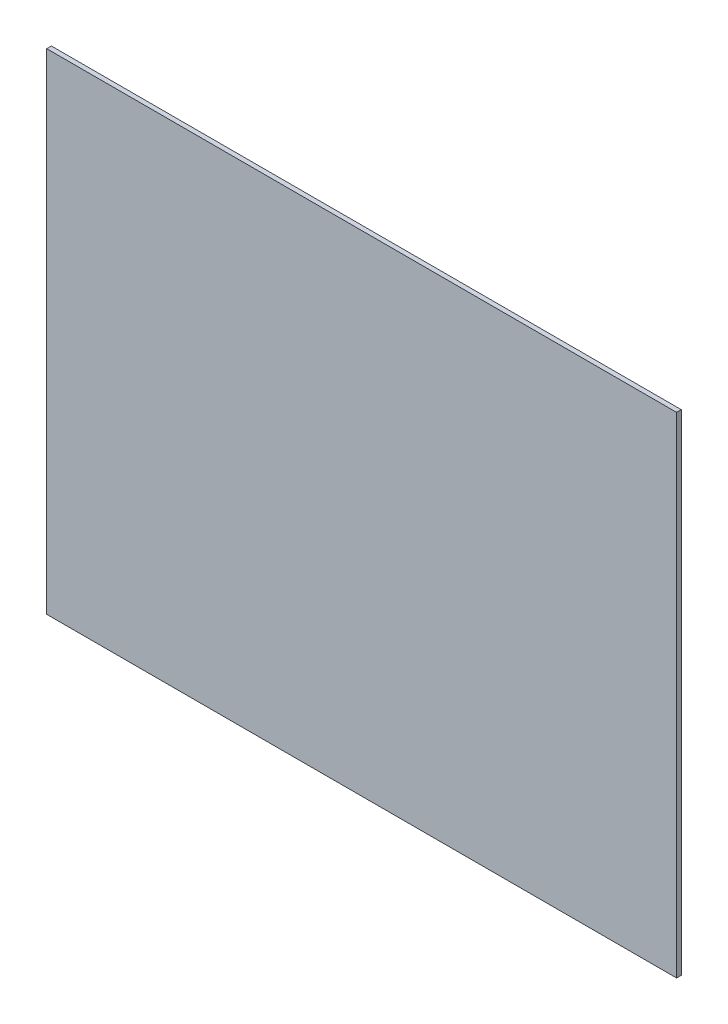
ISO-10303-21;
HEADER;
FILE_DESCRIPTION(('STEP AP214'),'2;1');
FILE_NAME('part.step','',(''),(''),'','','');
FILE_SCHEMA(('AUTOMOTIVE_DESIGN { 1 0 10303 214 1 1 1 1 }'));
ENDSEC;
DATA;
#1=APPLICATION_CONTEXT('core data for automotive mechanical design processes');
#2=APPLICATION_PROTOCOL_DEFINITION('international standard','automotive_design',2000,#1);
#3=PRODUCT_CONTEXT('',#1,'mechanical');
#4=PRODUCT('Part','Part','',(#3));
#5=PRODUCT_RELATED_PRODUCT_CATEGORY('part','',(#4));
#6=PRODUCT_DEFINITION_FORMATION('','',#4);
#7=PRODUCT_DEFINITION_CONTEXT('part definition',#1,'design');
#8=PRODUCT_DEFINITION('design','',#6,#7);
#9=PRODUCT_DEFINITION_SHAPE('','',#8);
#10=(LENGTH_UNIT() NAMED_UNIT(*) SI_UNIT(.MILLI.,.METRE.));
#11=(NAMED_UNIT(*) PLANE_ANGLE_UNIT() SI_UNIT($,.RADIAN.));
#12=(NAMED_UNIT(*) SI_UNIT($,.STERADIAN.) SOLID_ANGLE_UNIT());
#13=UNCERTAINTY_MEASURE_WITH_UNIT(LENGTH_MEASURE(1.E-05),#10,'distance_accuracy_value','');
#14=(GEOMETRIC_REPRESENTATION_CONTEXT(3) GLOBAL_UNCERTAINTY_ASSIGNED_CONTEXT((#13)) GLOBAL_UNIT_ASSIGNED_CONTEXT((#10,
#11,#12)) REPRESENTATION_CONTEXT('',''));
#15=CARTESIAN_POINT('',(0.,0.,0.));
#16=DIRECTION('',(0.,0.,1.));
#17=DIRECTION('',(1.,0.,0.));
#18=AXIS2_PLACEMENT_3D('',#15,#16,#17);
#19=CARTESIAN_POINT('',(270.,-210.,4.));
#20=DIRECTION('',(-1.,0.,0.));
#21=DIRECTION('',(0.,0.,1.));
#22=AXIS2_PLACEMENT_3D('',#19,#20,#21);
#23=PLANE('',#22);
#24=DIRECTION('',(0.,1.,0.));
#25=VECTOR('',#24,1.);
#26=CARTESIAN_POINT('',(270.,-210.,0.));
#27=LINE('',#26,#25);
#28=CARTESIAN_POINT('',(270.,-210.,0.));
#29=VERTEX_POINT('',#28);
#30=CARTESIAN_POINT('',(270.,210.,0.));
#31=VERTEX_POINT('',#30);
#32=EDGE_CURVE('E99',#29,#31,#27,.T.);
#33=ORIENTED_EDGE('',*,*,#32,.T.);
#34=DIRECTION('',(0.,0.,-1.));
#35=VECTOR('',#34,1.);
#36=CARTESIAN_POINT('',(270.,210.,4.));
#37=LINE('',#36,#35);
#38=CARTESIAN_POINT('',(270.,210.,4.));
#39=VERTEX_POINT('',#38);
#40=EDGE_CURVE('E11',#39,#31,#37,.T.);
#41=ORIENTED_EDGE('',*,*,#40,.F.);
#42=DIRECTION('',(0.,1.,0.));
#43=VECTOR('',#42,1.);
#44=CARTESIAN_POINT('',(270.,-210.,4.));
#45=LINE('',#44,#43);
#46=CARTESIAN_POINT('',(270.,-210.,4.));
#47=VERTEX_POINT('',#46);
#48=EDGE_CURVE('E87',#47,#39,#45,.T.);
#49=ORIENTED_EDGE('',*,*,#48,.F.);
#50=DIRECTION('',(0.,0.,-1.));
#51=VECTOR('',#50,1.);
#52=CARTESIAN_POINT('',(270.,-210.,4.));
#53=LINE('',#52,#51);
#54=EDGE_CURVE('E95',#47,#29,#53,.T.);
#55=ORIENTED_EDGE('',*,*,#54,.T.);
#56=EDGE_LOOP('',(#33,#41,#49,#55));
#57=FACE_BOUND('',#56,.T.);
#58=ADVANCED_FACE('F36',(#57),#23,.F.);
#59=CARTESIAN_POINT('',(-270.,210.,4.));
#60=DIRECTION('',(0.,-1.,0.));
#61=DIRECTION('',(0.,0.,-1.));
#62=AXIS2_PLACEMENT_3D('',#59,#60,#61);
#63=PLANE('',#62);
#64=DIRECTION('',(-1.,0.,0.));
#65=VECTOR('',#64,1.);
#66=CARTESIAN_POINT('',(-270.,210.,0.));
#67=LINE('',#66,#65);
#68=CARTESIAN_POINT('',(-270.,210.,0.));
#69=VERTEX_POINT('',#68);
#70=EDGE_CURVE('E91',#31,#69,#67,.T.);
#71=ORIENTED_EDGE('',*,*,#70,.T.);
#72=DIRECTION('',(0.,0.,-1.));
#73=VECTOR('',#72,1.);
#74=CARTESIAN_POINT('',(-270.,210.,4.));
#75=LINE('',#74,#73);
#76=CARTESIAN_POINT('',(-270.,210.,4.));
#77=VERTEX_POINT('',#76);
#78=EDGE_CURVE('E44',#77,#69,#75,.T.);
#79=ORIENTED_EDGE('',*,*,#78,.F.);
#80=DIRECTION('',(-1.,0.,0.));
#81=VECTOR('',#80,1.);
#82=CARTESIAN_POINT('',(-270.,210.,4.));
#83=LINE('',#82,#81);
#84=EDGE_CURVE('E82',#39,#77,#83,.T.);
#85=ORIENTED_EDGE('',*,*,#84,.F.);
#86=ORIENTED_EDGE('',*,*,#40,.T.);
#87=EDGE_LOOP('',(#71,#79,#85,#86));
#88=FACE_BOUND('',#87,.T.);
#89=ADVANCED_FACE('F90',(#88),#63,.F.);
#90=CARTESIAN_POINT('',(-270.,-210.,4.));
#91=DIRECTION('',(1.,0.,0.));
#92=DIRECTION('',(0.,0.,-1.));
#93=AXIS2_PLACEMENT_3D('',#90,#91,#92);
#94=PLANE('',#93);
#95=DIRECTION('',(0.,-1.,0.));
#96=VECTOR('',#95,1.);
#97=CARTESIAN_POINT('',(-270.,-210.,0.));
#98=LINE('',#97,#96);
#99=CARTESIAN_POINT('',(-270.,-210.,0.));
#100=VERTEX_POINT('',#99);
#101=EDGE_CURVE('E69',#69,#100,#98,.T.);
#102=ORIENTED_EDGE('',*,*,#101,.T.);
#103=DIRECTION('',(0.,0.,-1.));
#104=VECTOR('',#103,1.);
#105=CARTESIAN_POINT('',(-270.,-210.,4.));
#106=LINE('',#105,#104);
#107=CARTESIAN_POINT('',(-270.,-210.,4.));
#108=VERTEX_POINT('',#107);
#109=EDGE_CURVE('E92',#108,#100,#106,.T.);
#110=ORIENTED_EDGE('',*,*,#109,.F.);
#111=DIRECTION('',(0.,-1.,0.));
#112=VECTOR('',#111,1.);
#113=CARTESIAN_POINT('',(-270.,-210.,4.));
#114=LINE('',#113,#112);
#115=EDGE_CURVE('E85',#77,#108,#114,.T.);
#116=ORIENTED_EDGE('',*,*,#115,.F.);
#117=ORIENTED_EDGE('',*,*,#78,.T.);
#118=EDGE_LOOP('',(#102,#110,#116,#117));
#119=FACE_BOUND('',#118,.T.);
#120=ADVANCED_FACE('F93',(#119),#94,.F.);
#121=CARTESIAN_POINT('',(-270.,-210.,4.));
#122=DIRECTION('',(0.,1.,0.));
#123=DIRECTION('',(0.,0.,1.));
#124=AXIS2_PLACEMENT_3D('',#121,#122,#123);
#125=PLANE('',#124);
#126=DIRECTION('',(1.,0.,0.));
#127=VECTOR('',#126,1.);
#128=CARTESIAN_POINT('',(-270.,-210.,0.));
#129=LINE('',#128,#127);
#130=EDGE_CURVE('E75',#100,#29,#129,.T.);
#131=ORIENTED_EDGE('',*,*,#130,.T.);
#132=ORIENTED_EDGE('',*,*,#54,.F.);
#133=DIRECTION('',(1.,0.,0.));
#134=VECTOR('',#133,1.);
#135=CARTESIAN_POINT('',(-270.,-210.,4.));
#136=LINE('',#135,#134);
#137=EDGE_CURVE('E52',#108,#47,#136,.T.);
#138=ORIENTED_EDGE('',*,*,#137,.F.);
#139=ORIENTED_EDGE('',*,*,#109,.T.);
#140=EDGE_LOOP('',(#131,#132,#138,#139));
#141=FACE_BOUND('',#140,.T.);
#142=ADVANCED_FACE('F106',(#141),#125,.F.);
#143=CARTESIAN_POINT('',(0.,0.,4.));
#144=DIRECTION('',(0.,0.,-1.));
#145=DIRECTION('',(-1.,0.,0.));
#146=AXIS2_PLACEMENT_3D('',#143,#144,#145);
#147=PLANE('',#146);
#148=ORIENTED_EDGE('',*,*,#48,.T.);
#149=ORIENTED_EDGE('',*,*,#84,.T.);
#150=ORIENTED_EDGE('',*,*,#115,.T.);
#151=ORIENTED_EDGE('',*,*,#137,.T.);
#152=EDGE_LOOP('',(#148,#149,#150,#151));
#153=FACE_BOUND('',#152,.T.);
#154=ADVANCED_FACE('F83',(#153),#147,.F.);
#155=CARTESIAN_POINT('',(0.,0.,0.));
#156=DIRECTION('',(0.,0.,-1.));
#157=DIRECTION('',(-1.,0.,0.));
#158=AXIS2_PLACEMENT_3D('',#155,#156,#157);
#159=PLANE('',#158);
#160=ORIENTED_EDGE('',*,*,#32,.F.);
#161=ORIENTED_EDGE('',*,*,#130,.F.);
#162=ORIENTED_EDGE('',*,*,#101,.F.);
#163=ORIENTED_EDGE('',*,*,#70,.F.);
#164=EDGE_LOOP('',(#160,#161,#162,#163));
#165=FACE_BOUND('',#164,.T.);
#166=ADVANCED_FACE('F109',(#165),#159,.T.);
#167=CLOSED_SHELL('',(#58,#89,#120,#142,#154,#166));
#168=MANIFOLD_SOLID_BREP('B2',#167);
#169=ADVANCED_BREP_SHAPE_REPRESENTATION('',(#18,#168),#14);
#170=SHAPE_DEFINITION_REPRESENTATION(#9,#169);
ENDSEC;
END-ISO-10303-21;
